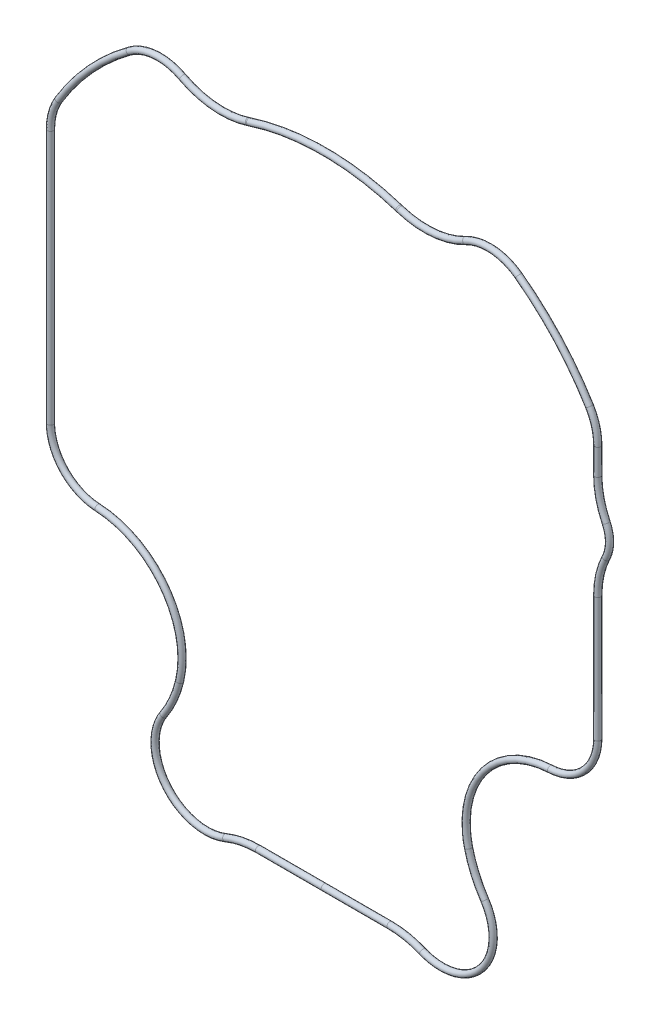
ISO-10303-21;
HEADER;
FILE_DESCRIPTION(('STEP AP214'),'2;1');
FILE_NAME('part.step','',(''),(''),'','','');
FILE_SCHEMA(('AUTOMOTIVE_DESIGN { 1 0 10303 214 1 1 1 1 }'));
ENDSEC;
DATA;
#1=APPLICATION_CONTEXT('core data for automotive mechanical design processes');
#2=APPLICATION_PROTOCOL_DEFINITION('international standard','automotive_design',2000,#1);
#3=PRODUCT_CONTEXT('',#1,'mechanical');
#4=PRODUCT('Part','Part','',(#3));
#5=PRODUCT_RELATED_PRODUCT_CATEGORY('part','',(#4));
#6=PRODUCT_DEFINITION_FORMATION('','',#4);
#7=PRODUCT_DEFINITION_CONTEXT('part definition',#1,'design');
#8=PRODUCT_DEFINITION('design','',#6,#7);
#9=PRODUCT_DEFINITION_SHAPE('','',#8);
#10=(LENGTH_UNIT() NAMED_UNIT(*) SI_UNIT(.MILLI.,.METRE.));
#11=(NAMED_UNIT(*) PLANE_ANGLE_UNIT() SI_UNIT($,.RADIAN.));
#12=(NAMED_UNIT(*) SI_UNIT($,.STERADIAN.) SOLID_ANGLE_UNIT());
#13=UNCERTAINTY_MEASURE_WITH_UNIT(LENGTH_MEASURE(1.E-05),#10,'distance_accuracy_value','');
#14=(GEOMETRIC_REPRESENTATION_CONTEXT(3) GLOBAL_UNCERTAINTY_ASSIGNED_CONTEXT((#13)) GLOBAL_UNIT_ASSIGNED_CONTEXT((#10,
#11,#12)) REPRESENTATION_CONTEXT('',''));
#15=CARTESIAN_POINT('',(0.,0.,0.));
#16=DIRECTION('',(0.,0.,1.));
#17=DIRECTION('',(1.,0.,0.));
#18=AXIS2_PLACEMENT_3D('',#15,#16,#17);
#19=CARTESIAN_POINT('',(0.,-133.9,0.));
#20=DIRECTION('',(-1.,0.,0.));
#21=DIRECTION('',(0.,0.,1.));
#22=AXIS2_PLACEMENT_3D('',#19,#20,#21);
#23=CYLINDRICAL_SURFACE('',#22,1.);
#24=CARTESIAN_POINT('',(-22.3011299795722,-133.9,0.));
#25=DIRECTION('',(1.,0.,0.));
#26=DIRECTION('',(0.,0.,-1.));
#27=AXIS2_PLACEMENT_3D('',#24,#25,#26);
#28=CIRCLE('',#27,1.);
#29=CARTESIAN_POINT('',(-22.3011299795722,-132.9,0.));
#30=VERTEX_POINT('',#29);
#31=EDGE_CURVE('E128',#30,#30,#28,.T.);
#32=ORIENTED_EDGE('',*,*,#31,.T.);
#33=EDGE_LOOP('',(#32));
#34=FACE_BOUND('',#33,.T.);
#35=CARTESIAN_POINT('',(0.,-133.9,0.));
#36=DIRECTION('',(1.,0.,0.));
#37=DIRECTION('',(0.,0.,-1.));
#38=AXIS2_PLACEMENT_3D('',#35,#36,#37);
#39=CIRCLE('',#38,1.);
#40=CARTESIAN_POINT('',(0.,-133.9,-1.));
#41=VERTEX_POINT('',#40);
#42=EDGE_CURVE('E131',#41,#41,#39,.T.);
#43=ORIENTED_EDGE('',*,*,#42,.F.);
#44=EDGE_LOOP('',(#43));
#45=FACE_BOUND('',#44,.T.);
#46=ADVANCED_FACE('F39',(#34,#45),#23,.T.);
#47=CARTESIAN_POINT('',(-22.3011299795722,-163.,0.));
#48=DIRECTION('',(0.,0.,1.));
#49=DIRECTION('',(1.,0.,0.));
#50=AXIS2_PLACEMENT_3D('',#47,#48,#49);
#51=TOROIDAL_SURFACE('',#50,29.1,1.);
#52=CARTESIAN_POINT('',(-33.3771970246141,-136.090322580645,0.));
#53=DIRECTION('',(0.924731182795699,0.380620860654362,0.));
#54=DIRECTION('',(0.,0.,-1.));
#55=AXIS2_PLACEMENT_3D('',#52,#53,#54);
#56=CIRCLE('',#55,1.);
#57=CARTESIAN_POINT('',(-33.7578178852685,-135.165591397849,0.));
#58=VERTEX_POINT('',#57);
#59=EDGE_CURVE('E125',#58,#58,#56,.T.);
#60=CARTESIAN_POINT('',(-22.3011299795722,-163.,0.));
#61=DIRECTION('',(0.,0.,1.));
#62=DIRECTION('',(1.,0.,0.));
#63=AXIS2_PLACEMENT_3D('',#60,#61,#62);
#64=CIRCLE('',#63,30.1);
#65=EDGE_CURVE('',#30,#58,#64,.T.);
#66=ORIENTED_EDGE('',*,*,#31,.F.);
#67=ORIENTED_EDGE('',*,*,#59,.T.);
#68=ORIENTED_EDGE('',*,*,#65,.T.);
#69=ORIENTED_EDGE('',*,*,#65,.F.);
#70=EDGE_LOOP('',(#66,#68,#67,#69));
#71=FACE_BOUND('',#70,.T.);
#72=ADVANCED_FACE('F138',(#71),#51,.T.);
#73=CARTESIAN_POINT('',(-40.,-120.,0.));
#74=DIRECTION('',(0.,0.,-1.));
#75=DIRECTION('',(-1.,0.,0.));
#76=AXIS2_PLACEMENT_3D('',#73,#74,#75);
#77=TOROIDAL_SURFACE('',#76,17.4,1.);
#78=CARTESIAN_POINT('',(-54.497710894711,-110.378338043073,0.));
#79=DIRECTION('',(-0.552969077984316,-0.833201775558103,0.));
#80=DIRECTION('',(0.,0.,-1.));
#81=AXIS2_PLACEMENT_3D('',#78,#79,#80);
#82=CIRCLE('',#81,1.);
#83=CARTESIAN_POINT('',(-53.6645091191529,-110.931307121057,0.));
#84=VERTEX_POINT('',#83);
#85=EDGE_CURVE('E122',#84,#84,#82,.T.);
#86=ORIENTED_EDGE('',*,*,#85,.T.);
#87=EDGE_LOOP('',(#86));
#88=FACE_BOUND('',#87,.T.);
#89=ORIENTED_EDGE('',*,*,#59,.F.);
#90=EDGE_LOOP('',(#89));
#91=FACE_BOUND('',#90,.T.);
#92=ADVANCED_FACE('F144',(#88,#91),#77,.T.);
#93=CARTESIAN_POINT('',(-87.0759003190326,-88.7572470938858,0.));
#94=DIRECTION('',(0.,0.,1.));
#95=DIRECTION('',(1.,0.,0.));
#96=AXIS2_PLACEMENT_3D('',#93,#94,#95);
#97=TOROIDAL_SURFACE('',#96,39.1,1.);
#98=CARTESIAN_POINT('',(-49.0182868864285,-97.7254163504547,0.));
#99=DIRECTION('',(-0.229364942623245,-0.973340496997549,0.));
#100=DIRECTION('',(0.,0.,-1.));
#101=AXIS2_PLACEMENT_3D('',#98,#99,#100);
#102=CIRCLE('',#101,1.);
#103=CARTESIAN_POINT('',(-48.0449463894309,-97.954781293078,0.));
#104=VERTEX_POINT('',#103);
#105=EDGE_CURVE('E119',#104,#104,#102,.T.);
#106=CARTESIAN_POINT('',(-87.0759003190326,-88.7572470938858,0.));
#107=DIRECTION('',(0.,0.,1.));
#108=DIRECTION('',(1.,0.,0.));
#109=AXIS2_PLACEMENT_3D('',#106,#107,#108);
#110=CIRCLE('',#109,40.1);
#111=EDGE_CURVE('',#84,#104,#110,.T.);
#112=ORIENTED_EDGE('',*,*,#85,.F.);
#113=ORIENTED_EDGE('',*,*,#105,.T.);
#114=ORIENTED_EDGE('',*,*,#111,.T.);
#115=ORIENTED_EDGE('',*,*,#111,.F.);
#116=EDGE_LOOP('',(#112,#114,#113,#115));
#117=FACE_BOUND('',#116,.T.);
#118=ADVANCED_FACE('F150',(#117),#97,.T.);
#119=CARTESIAN_POINT('',(-78.3158358460547,-90.821531577495,0.));
#120=DIRECTION('',(0.,0.,1.));
#121=DIRECTION('',(1.,0.,0.));
#122=AXIS2_PLACEMENT_3D('',#119,#120,#121);
#123=TOROIDAL_SURFACE('',#122,30.1,1.);
#124=CARTESIAN_POINT('',(-76.8327154425175,-60.7580927544227,0.));
#125=DIRECTION('',(0.998785342959213,-0.0492731031075466,0.));
#126=DIRECTION('',(0.,0.,-1.));
#127=AXIS2_PLACEMENT_3D('',#124,#125,#126);
#128=CIRCLE('',#127,1.);
#129=CARTESIAN_POINT('',(-76.78344233941,-59.7593074114635,0.));
#130=VERTEX_POINT('',#129);
#131=EDGE_CURVE('E116',#130,#130,#128,.T.);
#132=CARTESIAN_POINT('',(-78.3158358460547,-90.821531577495,0.));
#133=DIRECTION('',(0.,0.,1.));
#134=DIRECTION('',(1.,0.,0.));
#135=AXIS2_PLACEMENT_3D('',#132,#133,#134);
#136=CIRCLE('',#135,31.1);
#137=EDGE_CURVE('',#104,#130,#136,.T.);
#138=ORIENTED_EDGE('',*,*,#105,.F.);
#139=ORIENTED_EDGE('',*,*,#131,.T.);
#140=ORIENTED_EDGE('',*,*,#137,.T.);
#141=ORIENTED_EDGE('',*,*,#137,.F.);
#142=EDGE_LOOP('',(#138,#140,#139,#141));
#143=FACE_BOUND('',#142,.T.);
#144=ADVANCED_FACE('F154',(#143),#123,.T.);
#145=CARTESIAN_POINT('',(-76.,-43.878620458412,0.));
#146=DIRECTION('',(0.,0.,-1.));
#147=DIRECTION('',(-1.,0.,0.));
#148=AXIS2_PLACEMENT_3D('',#145,#146,#147);
#149=TOROIDAL_SURFACE('',#148,16.9,1.);
#150=CARTESIAN_POINT('',(-92.9,-43.878620458412,0.));
#151=DIRECTION('',(0.,-1.,0.));
#152=DIRECTION('',(0.,0.,-1.));
#153=AXIS2_PLACEMENT_3D('',#150,#151,#152);
#154=CIRCLE('',#153,1.);
#155=CARTESIAN_POINT('',(-92.9,-43.878620458412,-1.));
#156=VERTEX_POINT('',#155);
#157=EDGE_CURVE('E113',#156,#156,#154,.T.);
#158=ORIENTED_EDGE('',*,*,#157,.T.);
#159=EDGE_LOOP('',(#158));
#160=FACE_BOUND('',#159,.T.);
#161=ORIENTED_EDGE('',*,*,#131,.F.);
#162=EDGE_LOOP('',(#161));
#163=FACE_BOUND('',#162,.T.);
#164=ADVANCED_FACE('F158',(#160,#163),#149,.T.);
#165=CARTESIAN_POINT('',(-92.9,-43.878620458412,0.));
#166=DIRECTION('',(0.,1.,0.));
#167=DIRECTION('',(0.,0.,1.));
#168=AXIS2_PLACEMENT_3D('',#165,#166,#167);
#169=CYLINDRICAL_SURFACE('',#168,1.);
#170=CARTESIAN_POINT('',(-92.9,42.5,0.));
#171=DIRECTION('',(0.,-1.,0.));
#172=DIRECTION('',(0.,0.,-1.));
#173=AXIS2_PLACEMENT_3D('',#170,#171,#172);
#174=CIRCLE('',#173,1.);
#175=CARTESIAN_POINT('',(-93.9,42.5,0.));
#176=VERTEX_POINT('',#175);
#177=EDGE_CURVE('E110',#176,#176,#174,.T.);
#178=ORIENTED_EDGE('',*,*,#177,.T.);
#179=EDGE_LOOP('',(#178));
#180=FACE_BOUND('',#179,.T.);
#181=ORIENTED_EDGE('',*,*,#157,.F.);
#182=EDGE_LOOP('',(#181));
#183=FACE_BOUND('',#182,.T.);
#184=ADVANCED_FACE('F162',(#180,#183),#169,.T.);
#185=CARTESIAN_POINT('',(-73.5,42.5,0.));
#186=DIRECTION('',(0.,0.,-1.));
#187=DIRECTION('',(-1.,0.,0.));
#188=AXIS2_PLACEMENT_3D('',#185,#186,#187);
#189=TOROIDAL_SURFACE('',#188,19.4,1.);
#190=CARTESIAN_POINT('',(-90.0667511340075,52.5946895377649,0.));
#191=DIRECTION('',(-0.520344821534275,-0.853956244021006,0.));
#192=DIRECTION('',(0.,0.,-1.));
#193=AXIS2_PLACEMENT_3D('',#190,#191,#192);
#194=CIRCLE('',#193,1.);
#195=CARTESIAN_POINT('',(-90.9207073780285,53.1150343592992,0.));
#196=VERTEX_POINT('',#195);
#197=EDGE_CURVE('E107',#196,#196,#194,.T.);
#198=CARTESIAN_POINT('',(-73.5,42.5,0.));
#199=DIRECTION('',(0.,0.,-1.));
#200=DIRECTION('',(-1.,0.,0.));
#201=AXIS2_PLACEMENT_3D('',#198,#199,#200);
#202=CIRCLE('',#201,20.4);
#203=EDGE_CURVE('',#176,#196,#202,.T.);
#204=ORIENTED_EDGE('',*,*,#177,.F.);
#205=ORIENTED_EDGE('',*,*,#197,.T.);
#206=ORIENTED_EDGE('',*,*,#203,.T.);
#207=ORIENTED_EDGE('',*,*,#203,.F.);
#208=EDGE_LOOP('',(#204,#206,#205,#207));
#209=FACE_BOUND('',#208,.T.);
#210=ADVANCED_FACE('F166',(#209),#189,.T.);
#211=CARTESIAN_POINT('',(-11.0621306741118,4.45446523304476,0.));
#212=DIRECTION('',(0.,0.,-1.));
#213=DIRECTION('',(-1.,0.,0.));
#214=AXIS2_PLACEMENT_3D('',#211,#212,#213);
#215=TOROIDAL_SURFACE('',#214,92.5160053726973,1.);
#216=CARTESIAN_POINT('',(-66.0435084855954,78.860508966547,0.));
#217=DIRECTION('',(-0.804250501670065,-0.594290442934638,0.));
#218=DIRECTION('',(0.,0.,-1.));
#219=AXIS2_PLACEMENT_3D('',#216,#217,#218);
#220=CIRCLE('',#219,1.);
#221=CARTESIAN_POINT('',(-66.6377989285301,79.6647594682171,0.));
#222=VERTEX_POINT('',#221);
#223=EDGE_CURVE('E104',#222,#222,#220,.T.);
#224=CARTESIAN_POINT('',(-11.0621306741118,4.45446523304476,0.));
#225=DIRECTION('',(0.,0.,-1.));
#226=DIRECTION('',(-1.,0.,0.));
#227=AXIS2_PLACEMENT_3D('',#224,#225,#226);
#228=CIRCLE('',#227,93.5160053726973);
#229=EDGE_CURVE('',#196,#222,#228,.T.);
#230=ORIENTED_EDGE('',*,*,#197,.F.);
#231=ORIENTED_EDGE('',*,*,#223,.T.);
#232=ORIENTED_EDGE('',*,*,#229,.T.);
#233=ORIENTED_EDGE('',*,*,#229,.F.);
#234=EDGE_LOOP('',(#230,#232,#231,#233));
#235=FACE_BOUND('',#234,.T.);
#236=ADVANCED_FACE('F170',(#235),#215,.T.);
#237=CARTESIAN_POINT('',(-56.,65.2686754883229,0.));
#238=DIRECTION('',(0.,0.,-1.));
#239=DIRECTION('',(-1.,0.,0.));
#240=AXIS2_PLACEMENT_3D('',#237,#238,#239);
#241=TOROIDAL_SURFACE('',#240,16.9,1.);
#242=CARTESIAN_POINT('',(-48.1416378933798,80.2304984053754,0.));
#243=DIRECTION('',(-0.885314965506062,0.464991840628414,0.));
#244=DIRECTION('',(0.,0.,-1.));
#245=AXIS2_PLACEMENT_3D('',#242,#243,#244);
#246=CIRCLE('',#245,1.);
#247=CARTESIAN_POINT('',(-47.6766460527514,81.1158133708814,0.));
#248=VERTEX_POINT('',#247);
#249=EDGE_CURVE('E101',#248,#248,#246,.T.);
#250=CARTESIAN_POINT('',(-56.,65.2686754883229,0.));
#251=DIRECTION('',(0.,0.,-1.));
#252=DIRECTION('',(-1.,0.,0.));
#253=AXIS2_PLACEMENT_3D('',#250,#251,#252);
#254=CIRCLE('',#253,17.9);
#255=EDGE_CURVE('',#222,#248,#254,.T.);
#256=ORIENTED_EDGE('',*,*,#223,.F.);
#257=ORIENTED_EDGE('',*,*,#249,.T.);
#258=ORIENTED_EDGE('',*,*,#255,.T.);
#259=ORIENTED_EDGE('',*,*,#255,.F.);
#260=EDGE_LOOP('',(#256,#258,#257,#259));
#261=FACE_BOUND('',#260,.T.);
#262=ADVANCED_FACE('F174',(#261),#241,.T.);
#263=CARTESIAN_POINT('',(-34.6103753310929,105.993163901602,0.));
#264=DIRECTION('',(0.,0.,1.));
#265=DIRECTION('',(1.,0.,0.));
#266=AXIS2_PLACEMENT_3D('',#263,#264,#265);
#267=TOROIDAL_SURFACE('',#266,29.1,1.);
#268=CARTESIAN_POINT('',(-25.6825903621794,78.2965096713731,0.));
#269=DIRECTION('',(-0.951775059458029,-0.306796734326925,0.));
#270=DIRECTION('',(0.,0.,-1.));
#271=AXIS2_PLACEMENT_3D('',#268,#269,#270);
#272=CIRCLE('',#271,1.);
#273=CARTESIAN_POINT('',(-25.6825903621794,78.2965096713731,-1.));
#274=VERTEX_POINT('',#273);
#275=EDGE_CURVE('E98',#274,#274,#272,.T.);
#276=ORIENTED_EDGE('',*,*,#275,.T.);
#277=EDGE_LOOP('',(#276));
#278=FACE_BOUND('',#277,.T.);
#279=ORIENTED_EDGE('',*,*,#249,.F.);
#280=EDGE_LOOP('',(#279));
#281=FACE_BOUND('',#280,.T.);
#282=ADVANCED_FACE('F178',(#278,#281),#267,.T.);
#283=CARTESIAN_POINT('',(-25.6825903621794,78.2965096713731,0.));
#284=DIRECTION('',(0.951775059458041,0.306796734326887,0.));
#285=DIRECTION('',(-0.306796734326887,0.951775059458041,0.));
#286=AXIS2_PLACEMENT_3D('',#283,#284,#285);
#287=CYLINDRICAL_SURFACE('',#286,1.);
#288=CARTESIAN_POINT('',(-25.2800509085364,78.4262648993423,0.));
#289=DIRECTION('',(-0.951775059458041,-0.306796734326887,0.));
#290=DIRECTION('',(0.,0.,-1.));
#291=AXIS2_PLACEMENT_3D('',#288,#289,#290);
#292=CIRCLE('',#291,1.);
#293=CARTESIAN_POINT('',(-25.5868476428633,79.3780399588004,0.));
#294=VERTEX_POINT('',#293);
#295=EDGE_CURVE('E95',#294,#294,#292,.T.);
#296=ORIENTED_EDGE('',*,*,#295,.T.);
#297=EDGE_LOOP('',(#296));
#298=FACE_BOUND('',#297,.T.);
#299=ORIENTED_EDGE('',*,*,#275,.F.);
#300=EDGE_LOOP('',(#299));
#301=FACE_BOUND('',#300,.T.);
#302=ADVANCED_FACE('F182',(#298,#301),#287,.T.);
#303=CARTESIAN_POINT('',(0.,0.,0.));
#304=DIRECTION('',(0.,0.,-1.));
#305=DIRECTION('',(-1.,0.,0.));
#306=AXIS2_PLACEMENT_3D('',#303,#304,#305);
#307=TOROIDAL_SURFACE('',#306,82.4,1.);
#308=CARTESIAN_POINT('',(25.2800509085517,78.4262648993374,0.));
#309=DIRECTION('',(-0.951775059457978,0.306796734327083,0.));
#310=DIRECTION('',(0.,0.,-1.));
#311=AXIS2_PLACEMENT_3D('',#308,#309,#310);
#312=CIRCLE('',#311,1.);
#313=CARTESIAN_POINT('',(25.5868476428788,79.3780399587954,0.));
#314=VERTEX_POINT('',#313);
#315=EDGE_CURVE('E92',#314,#314,#312,.T.);
#316=CARTESIAN_POINT('',(0.,0.,0.));
#317=DIRECTION('',(0.,0.,-1.));
#318=DIRECTION('',(-1.,0.,0.));
#319=AXIS2_PLACEMENT_3D('',#316,#317,#318);
#320=CIRCLE('',#319,83.4);
#321=EDGE_CURVE('',#294,#314,#320,.T.);
#322=ORIENTED_EDGE('',*,*,#295,.F.);
#323=ORIENTED_EDGE('',*,*,#315,.T.);
#324=ORIENTED_EDGE('',*,*,#321,.T.);
#325=ORIENTED_EDGE('',*,*,#321,.F.);
#326=EDGE_LOOP('',(#322,#324,#323,#325));
#327=FACE_BOUND('',#326,.T.);
#328=ADVANCED_FACE('F186',(#327),#307,.T.);
#329=CARTESIAN_POINT('',(25.2800509085517,78.4262648993374,0.));
#330=DIRECTION('',(0.951775059457979,-0.306796734327079,0.));
#331=DIRECTION('',(0.306796734327079,0.951775059457979,0.));
#332=AXIS2_PLACEMENT_3D('',#329,#330,#331);
#333=CYLINDRICAL_SURFACE('',#332,1.);
#334=CARTESIAN_POINT('',(25.682590362175,78.2965096713745,0.));
#335=DIRECTION('',(-0.951775059457979,0.306796734327079,0.));
#336=DIRECTION('',(0.,0.,-1.));
#337=AXIS2_PLACEMENT_3D('',#334,#335,#336);
#338=CIRCLE('',#337,1.);
#339=CARTESIAN_POINT('',(25.3757936278479,77.3447346119165,0.));
#340=VERTEX_POINT('',#339);
#341=EDGE_CURVE('E89',#340,#340,#338,.T.);
#342=ORIENTED_EDGE('',*,*,#341,.T.);
#343=EDGE_LOOP('',(#342));
#344=FACE_BOUND('',#343,.T.);
#345=ORIENTED_EDGE('',*,*,#315,.F.);
#346=EDGE_LOOP('',(#345));
#347=FACE_BOUND('',#346,.T.);
#348=ADVANCED_FACE('F190',(#344,#347),#333,.T.);
#349=CARTESIAN_POINT('',(34.6103753310929,105.993163901602,0.));
#350=DIRECTION('',(0.,0.,1.));
#351=DIRECTION('',(1.,0.,0.));
#352=AXIS2_PLACEMENT_3D('',#349,#350,#351);
#353=TOROIDAL_SURFACE('',#352,29.1,1.);
#354=CARTESIAN_POINT('',(48.1416378933798,80.2304984053753,0.));
#355=DIRECTION('',(-0.885314965506061,-0.464991840628416,0.));
#356=DIRECTION('',(0.,0.,-1.));
#357=AXIS2_PLACEMENT_3D('',#354,#355,#356);
#358=CIRCLE('',#357,1.);
#359=CARTESIAN_POINT('',(48.6066297340082,79.3451834398692,0.));
#360=VERTEX_POINT('',#359);
#361=EDGE_CURVE('E86',#360,#360,#358,.T.);
#362=CARTESIAN_POINT('',(34.6103753310929,105.993163901602,0.));
#363=DIRECTION('',(0.,0.,1.));
#364=DIRECTION('',(1.,0.,0.));
#365=AXIS2_PLACEMENT_3D('',#362,#363,#364);
#366=CIRCLE('',#365,30.1);
#367=EDGE_CURVE('',#340,#360,#366,.T.);
#368=ORIENTED_EDGE('',*,*,#341,.F.);
#369=ORIENTED_EDGE('',*,*,#361,.T.);
#370=ORIENTED_EDGE('',*,*,#367,.T.);
#371=ORIENTED_EDGE('',*,*,#367,.F.);
#372=EDGE_LOOP('',(#368,#370,#369,#371));
#373=FACE_BOUND('',#372,.T.);
#374=ADVANCED_FACE('F194',(#373),#353,.T.);
#375=CARTESIAN_POINT('',(56.,65.2686754883229,0.));
#376=DIRECTION('',(0.,0.,-1.));
#377=DIRECTION('',(-1.,0.,0.));
#378=AXIS2_PLACEMENT_3D('',#375,#376,#377);
#379=TOROIDAL_SURFACE('',#378,16.9,1.);
#380=CARTESIAN_POINT('',(66.0435084855954,78.860508966547,0.));
#381=DIRECTION('',(-0.804250501670067,0.594290442934637,0.));
#382=DIRECTION('',(0.,0.,-1.));
#383=AXIS2_PLACEMENT_3D('',#380,#381,#382);
#384=CIRCLE('',#383,1.);
#385=CARTESIAN_POINT('',(66.63779892853,79.6647594682171,0.));
#386=VERTEX_POINT('',#385);
#387=EDGE_CURVE('E83',#386,#386,#384,.T.);
#388=ORIENTED_EDGE('',*,*,#387,.T.);
#389=EDGE_LOOP('',(#388));
#390=FACE_BOUND('',#389,.T.);
#391=ORIENTED_EDGE('',*,*,#361,.F.);
#392=EDGE_LOOP('',(#391));
#393=FACE_BOUND('',#392,.T.);
#394=ADVANCED_FACE('F198',(#390,#393),#379,.T.);
#395=CARTESIAN_POINT('',(11.0621306741118,4.45446523304477,0.));
#396=DIRECTION('',(0.,0.,-1.));
#397=DIRECTION('',(-1.,0.,0.));
#398=AXIS2_PLACEMENT_3D('',#395,#396,#397);
#399=TOROIDAL_SURFACE('',#398,92.5160053726973,1.);
#400=CARTESIAN_POINT('',(90.0667511340075,52.5946895377649,0.));
#401=DIRECTION('',(-0.520344821534275,0.853956244021006,0.));
#402=DIRECTION('',(0.,0.,-1.));
#403=AXIS2_PLACEMENT_3D('',#400,#401,#402);
#404=CIRCLE('',#403,1.);
#405=CARTESIAN_POINT('',(90.9207073780285,53.1150343592992,0.));
#406=VERTEX_POINT('',#405);
#407=EDGE_CURVE('E80',#406,#406,#404,.T.);
#408=CARTESIAN_POINT('',(11.0621306741118,4.45446523304477,0.));
#409=DIRECTION('',(0.,0.,-1.));
#410=DIRECTION('',(-1.,0.,0.));
#411=AXIS2_PLACEMENT_3D('',#408,#409,#410);
#412=CIRCLE('',#411,93.5160053726973);
#413=EDGE_CURVE('',#386,#406,#412,.T.);
#414=ORIENTED_EDGE('',*,*,#387,.F.);
#415=ORIENTED_EDGE('',*,*,#407,.T.);
#416=ORIENTED_EDGE('',*,*,#413,.T.);
#417=ORIENTED_EDGE('',*,*,#413,.F.);
#418=EDGE_LOOP('',(#414,#416,#415,#417));
#419=FACE_BOUND('',#418,.T.);
#420=ADVANCED_FACE('F202',(#419),#399,.T.);
#421=CARTESIAN_POINT('',(73.5,42.5,0.));
#422=DIRECTION('',(0.,0.,-1.));
#423=DIRECTION('',(-1.,0.,0.));
#424=AXIS2_PLACEMENT_3D('',#421,#422,#423);
#425=TOROIDAL_SURFACE('',#424,19.4,1.);
#426=CARTESIAN_POINT('',(92.9,42.5,0.));
#427=DIRECTION('',(0.,1.,0.));
#428=DIRECTION('',(0.,0.,-1.));
#429=AXIS2_PLACEMENT_3D('',#426,#427,#428);
#430=CIRCLE('',#429,1.);
#431=CARTESIAN_POINT('',(93.9,42.5,0.));
#432=VERTEX_POINT('',#431);
#433=EDGE_CURVE('E77',#432,#432,#430,.T.);
#434=CARTESIAN_POINT('',(73.5,42.5,0.));
#435=DIRECTION('',(0.,0.,-1.));
#436=DIRECTION('',(-1.,0.,0.));
#437=AXIS2_PLACEMENT_3D('',#434,#435,#436);
#438=CIRCLE('',#437,20.4);
#439=EDGE_CURVE('',#406,#432,#438,.T.);
#440=ORIENTED_EDGE('',*,*,#407,.F.);
#441=ORIENTED_EDGE('',*,*,#433,.T.);
#442=ORIENTED_EDGE('',*,*,#439,.T.);
#443=ORIENTED_EDGE('',*,*,#439,.F.);
#444=EDGE_LOOP('',(#440,#442,#441,#443));
#445=FACE_BOUND('',#444,.T.);
#446=ADVANCED_FACE('F206',(#445),#425,.T.);
#447=CARTESIAN_POINT('',(92.9,42.5,0.));
#448=DIRECTION('',(0.,-1.,0.));
#449=DIRECTION('',(0.,0.,-1.));
#450=AXIS2_PLACEMENT_3D('',#447,#448,#449);
#451=CYLINDRICAL_SURFACE('',#450,1.);
#452=CARTESIAN_POINT('',(92.9,33.6635217326557,0.));
#453=DIRECTION('',(0.,1.,0.));
#454=DIRECTION('',(0.,0.,-1.));
#455=AXIS2_PLACEMENT_3D('',#452,#453,#454);
#456=CIRCLE('',#455,1.);
#457=CARTESIAN_POINT('',(91.9,33.6635217326557,0.));
#458=VERTEX_POINT('',#457);
#459=EDGE_CURVE('E74',#458,#458,#456,.T.);
#460=ORIENTED_EDGE('',*,*,#459,.T.);
#461=EDGE_LOOP('',(#460));
#462=FACE_BOUND('',#461,.T.);
#463=ORIENTED_EDGE('',*,*,#433,.F.);
#464=EDGE_LOOP('',(#463));
#465=FACE_BOUND('',#464,.T.);
#466=ADVANCED_FACE('F210',(#462,#465),#451,.T.);
#467=CARTESIAN_POINT('',(122.,33.6635217326557,0.));
#468=DIRECTION('',(0.,0.,1.));
#469=DIRECTION('',(1.,0.,0.));
#470=AXIS2_PLACEMENT_3D('',#467,#468,#469);
#471=TOROIDAL_SURFACE('',#470,29.1,1.);
#472=CARTESIAN_POINT('',(95.7390243902439,21.1267294785025,0.));
#473=DIRECTION('',(-0.430817603235504,0.902439024390244,0.));
#474=DIRECTION('',(0.,0.,-1.));
#475=AXIS2_PLACEMENT_3D('',#472,#473,#474);
#476=CIRCLE('',#475,1.);
#477=CARTESIAN_POINT('',(94.8365853658537,20.695911875267,0.));
#478=VERTEX_POINT('',#477);
#479=EDGE_CURVE('E71',#478,#478,#476,.T.);
#480=CARTESIAN_POINT('',(122.,33.6635217326557,0.));
#481=DIRECTION('',(0.,0.,1.));
#482=DIRECTION('',(1.,0.,0.));
#483=AXIS2_PLACEMENT_3D('',#480,#481,#482);
#484=CIRCLE('',#483,30.1);
#485=EDGE_CURVE('',#458,#478,#484,.T.);
#486=ORIENTED_EDGE('',*,*,#459,.F.);
#487=ORIENTED_EDGE('',*,*,#479,.T.);
#488=ORIENTED_EDGE('',*,*,#485,.T.);
#489=ORIENTED_EDGE('',*,*,#485,.F.);
#490=EDGE_LOOP('',(#486,#488,#487,#489));
#491=FACE_BOUND('',#490,.T.);
#492=ADVANCED_FACE('F214',(#491),#471,.T.);
#493=CARTESIAN_POINT('',(85.,16.,0.));
#494=DIRECTION('',(0.,0.,-1.));
#495=DIRECTION('',(-1.,0.,0.));
#496=AXIS2_PLACEMENT_3D('',#493,#494,#495);
#497=TOROIDAL_SURFACE('',#496,11.9,1.);
#498=CARTESIAN_POINT('',(95.7390243902439,10.8732705214975,0.));
#499=DIRECTION('',(0.430817603235505,0.902439024390244,0.));
#500=DIRECTION('',(0.,0.,-1.));
#501=AXIS2_PLACEMENT_3D('',#498,#499,#500);
#502=CIRCLE('',#501,1.);
#503=CARTESIAN_POINT('',(94.8365853658537,11.304088124733,0.));
#504=VERTEX_POINT('',#503);
#505=EDGE_CURVE('E68',#504,#504,#502,.T.);
#506=ORIENTED_EDGE('',*,*,#505,.T.);
#507=EDGE_LOOP('',(#506));
#508=FACE_BOUND('',#507,.T.);
#509=ORIENTED_EDGE('',*,*,#479,.F.);
#510=EDGE_LOOP('',(#509));
#511=FACE_BOUND('',#510,.T.);
#512=ADVANCED_FACE('F218',(#508,#511),#497,.T.);
#513=CARTESIAN_POINT('',(122.,-1.6635217326557,0.));
#514=DIRECTION('',(0.,0.,1.));
#515=DIRECTION('',(1.,0.,0.));
#516=AXIS2_PLACEMENT_3D('',#513,#514,#515);
#517=TOROIDAL_SURFACE('',#516,29.1,1.);
#518=CARTESIAN_POINT('',(92.9,-1.6635217326557,0.));
#519=DIRECTION('',(0.,1.,0.));
#520=DIRECTION('',(0.,0.,-1.));
#521=AXIS2_PLACEMENT_3D('',#518,#519,#520);
#522=CIRCLE('',#521,1.);
#523=CARTESIAN_POINT('',(91.9,-1.6635217326557,0.));
#524=VERTEX_POINT('',#523);
#525=EDGE_CURVE('E65',#524,#524,#522,.T.);
#526=CARTESIAN_POINT('',(122.,-1.6635217326557,0.));
#527=DIRECTION('',(0.,0.,1.));
#528=DIRECTION('',(1.,0.,0.));
#529=AXIS2_PLACEMENT_3D('',#526,#527,#528);
#530=CIRCLE('',#529,30.1);
#531=EDGE_CURVE('',#504,#524,#530,.T.);
#532=ORIENTED_EDGE('',*,*,#505,.F.);
#533=ORIENTED_EDGE('',*,*,#525,.T.);
#534=ORIENTED_EDGE('',*,*,#531,.T.);
#535=ORIENTED_EDGE('',*,*,#531,.F.);
#536=EDGE_LOOP('',(#532,#534,#533,#535));
#537=FACE_BOUND('',#536,.T.);
#538=ADVANCED_FACE('F222',(#537),#517,.T.);
#539=CARTESIAN_POINT('',(92.9,-1.66352173265571,0.));
#540=DIRECTION('',(0.,-1.,0.));
#541=DIRECTION('',(0.,0.,-1.));
#542=AXIS2_PLACEMENT_3D('',#539,#540,#541);
#543=CYLINDRICAL_SURFACE('',#542,1.);
#544=CARTESIAN_POINT('',(92.9,-43.878620458412,0.));
#545=DIRECTION('',(0.,1.,0.));
#546=DIRECTION('',(0.,0.,-1.));
#547=AXIS2_PLACEMENT_3D('',#544,#545,#546);
#548=CIRCLE('',#547,1.);
#549=CARTESIAN_POINT('',(93.9,-43.878620458412,0.));
#550=VERTEX_POINT('',#549);
#551=EDGE_CURVE('E62',#550,#550,#548,.T.);
#552=ORIENTED_EDGE('',*,*,#551,.T.);
#553=EDGE_LOOP('',(#552));
#554=FACE_BOUND('',#553,.T.);
#555=ORIENTED_EDGE('',*,*,#525,.F.);
#556=EDGE_LOOP('',(#555));
#557=FACE_BOUND('',#556,.T.);
#558=ADVANCED_FACE('F226',(#554,#557),#543,.T.);
#559=CARTESIAN_POINT('',(76.,-43.878620458412,0.));
#560=DIRECTION('',(0.,0.,-1.));
#561=DIRECTION('',(-1.,0.,0.));
#562=AXIS2_PLACEMENT_3D('',#559,#560,#561);
#563=TOROIDAL_SURFACE('',#562,16.9,1.);
#564=CARTESIAN_POINT('',(76.8327154425175,-60.7580927544227,0.));
#565=DIRECTION('',(0.998785342959213,0.0492731031075465,0.));
#566=DIRECTION('',(0.,0.,-1.));
#567=AXIS2_PLACEMENT_3D('',#564,#565,#566);
#568=CIRCLE('',#567,1.);
#569=CARTESIAN_POINT('',(76.8819885456251,-61.7568780973819,0.));
#570=VERTEX_POINT('',#569);
#571=EDGE_CURVE('E59',#570,#570,#568,.T.);
#572=CARTESIAN_POINT('',(76.,-43.878620458412,0.));
#573=DIRECTION('',(0.,0.,-1.));
#574=DIRECTION('',(-1.,0.,0.));
#575=AXIS2_PLACEMENT_3D('',#572,#573,#574);
#576=CIRCLE('',#575,17.9);
#577=EDGE_CURVE('',#550,#570,#576,.T.);
#578=ORIENTED_EDGE('',*,*,#551,.F.);
#579=ORIENTED_EDGE('',*,*,#571,.T.);
#580=ORIENTED_EDGE('',*,*,#577,.T.);
#581=ORIENTED_EDGE('',*,*,#577,.F.);
#582=EDGE_LOOP('',(#578,#580,#579,#581));
#583=FACE_BOUND('',#582,.T.);
#584=ADVANCED_FACE('F230',(#583),#563,.T.);
#585=CARTESIAN_POINT('',(78.3158358460547,-90.821531577495,0.));
#586=DIRECTION('',(0.,0.,1.));
#587=DIRECTION('',(1.,0.,0.));
#588=AXIS2_PLACEMENT_3D('',#585,#586,#587);
#589=TOROIDAL_SURFACE('',#588,30.1,1.);
#590=CARTESIAN_POINT('',(49.0182868864284,-97.7254163504547,0.));
#591=DIRECTION('',(-0.229364942623245,0.973340496997549,0.));
#592=DIRECTION('',(0.,0.,-1.));
#593=AXIS2_PLACEMENT_3D('',#590,#591,#592);
#594=CIRCLE('',#593,1.);
#595=CARTESIAN_POINT('',(48.0449463894308,-97.954781293078,0.));
#596=VERTEX_POINT('',#595);
#597=EDGE_CURVE('E54',#596,#596,#594,.T.);
#598=ORIENTED_EDGE('',*,*,#597,.T.);
#599=EDGE_LOOP('',(#598));
#600=FACE_BOUND('',#599,.T.);
#601=ORIENTED_EDGE('',*,*,#571,.F.);
#602=EDGE_LOOP('',(#601));
#603=FACE_BOUND('',#602,.T.);
#604=ADVANCED_FACE('F234',(#600,#603),#589,.T.);
#605=CARTESIAN_POINT('',(87.0759003190326,-88.7572470938858,0.));
#606=DIRECTION('',(0.,0.,1.));
#607=DIRECTION('',(1.,0.,0.));
#608=AXIS2_PLACEMENT_3D('',#605,#606,#607);
#609=TOROIDAL_SURFACE('',#608,39.1000000000001,1.);
#610=CARTESIAN_POINT('',(54.4977108947109,-110.378338043073,0.));
#611=DIRECTION('',(-0.552969077984322,0.833201775558099,0.));
#612=DIRECTION('',(0.,0.,-1.));
#613=AXIS2_PLACEMENT_3D('',#610,#611,#612);
#614=CIRCLE('',#613,1.);
#615=CARTESIAN_POINT('',(53.6645091191528,-110.931307121057,0.));
#616=VERTEX_POINT('',#615);
#617=EDGE_CURVE('E50',#616,#616,#614,.T.);
#618=CARTESIAN_POINT('',(87.0759003190326,-88.7572470938858,0.));
#619=DIRECTION('',(0.,0.,1.));
#620=DIRECTION('',(1.,0.,0.));
#621=AXIS2_PLACEMENT_3D('',#618,#619,#620);
#622=CIRCLE('',#621,40.1000000000001);
#623=EDGE_CURVE('',#596,#616,#622,.T.);
#624=ORIENTED_EDGE('',*,*,#597,.F.);
#625=ORIENTED_EDGE('',*,*,#617,.T.);
#626=ORIENTED_EDGE('',*,*,#623,.T.);
#627=ORIENTED_EDGE('',*,*,#623,.F.);
#628=EDGE_LOOP('',(#624,#626,#625,#627));
#629=FACE_BOUND('',#628,.T.);
#630=ADVANCED_FACE('F238',(#629),#609,.T.);
#631=CARTESIAN_POINT('',(40.,-120.,0.));
#632=DIRECTION('',(0.,0.,-1.));
#633=DIRECTION('',(-1.,0.,0.));
#634=AXIS2_PLACEMENT_3D('',#631,#632,#633);
#635=TOROIDAL_SURFACE('',#634,17.4,1.);
#636=CARTESIAN_POINT('',(33.3771970246141,-136.090322580645,0.));
#637=DIRECTION('',(0.9247311827957,-0.38062086065436,0.));
#638=DIRECTION('',(0.,0.,-1.));
#639=AXIS2_PLACEMENT_3D('',#636,#637,#638);
#640=CIRCLE('',#639,1.);
#641=CARTESIAN_POINT('',(33.7578178852685,-135.165591397849,0.));
#642=VERTEX_POINT('',#641);
#643=EDGE_CURVE('E46',#642,#642,#640,.T.);
#644=ORIENTED_EDGE('',*,*,#643,.T.);
#645=EDGE_LOOP('',(#644));
#646=FACE_BOUND('',#645,.T.);
#647=ORIENTED_EDGE('',*,*,#617,.F.);
#648=EDGE_LOOP('',(#647));
#649=FACE_BOUND('',#648,.T.);
#650=ADVANCED_FACE('F242',(#646,#649),#635,.T.);
#651=CARTESIAN_POINT('',(22.3011299795722,-163.,0.));
#652=DIRECTION('',(0.,0.,1.));
#653=DIRECTION('',(1.,0.,0.));
#654=AXIS2_PLACEMENT_3D('',#651,#652,#653);
#655=TOROIDAL_SURFACE('',#654,29.1,1.);
#656=CARTESIAN_POINT('',(22.3011299795722,-133.9,0.));
#657=DIRECTION('',(1.,0.,0.));
#658=DIRECTION('',(0.,0.,-1.));
#659=AXIS2_PLACEMENT_3D('',#656,#657,#658);
#660=CIRCLE('',#659,1.);
#661=CARTESIAN_POINT('',(22.3011299795722,-132.9,0.));
#662=VERTEX_POINT('',#661);
#663=EDGE_CURVE('E10',#662,#662,#660,.T.);
#664=CARTESIAN_POINT('',(22.3011299795722,-163.,0.));
#665=DIRECTION('',(0.,0.,1.));
#666=DIRECTION('',(1.,0.,0.));
#667=AXIS2_PLACEMENT_3D('',#664,#665,#666);
#668=CIRCLE('',#667,30.1);
#669=EDGE_CURVE('',#642,#662,#668,.T.);
#670=ORIENTED_EDGE('',*,*,#643,.F.);
#671=ORIENTED_EDGE('',*,*,#663,.T.);
#672=ORIENTED_EDGE('',*,*,#669,.T.);
#673=ORIENTED_EDGE('',*,*,#669,.F.);
#674=EDGE_LOOP('',(#670,#672,#671,#673));
#675=FACE_BOUND('',#674,.T.);
#676=ADVANCED_FACE('F245',(#675),#655,.T.);
#677=CARTESIAN_POINT('',(22.3011299795722,-133.9,0.));
#678=DIRECTION('',(-1.,0.,0.));
#679=DIRECTION('',(0.,0.,1.));
#680=AXIS2_PLACEMENT_3D('',#677,#678,#679);
#681=CYLINDRICAL_SURFACE('',#680,1.);
#682=ORIENTED_EDGE('',*,*,#42,.T.);
#683=EDGE_LOOP('',(#682));
#684=FACE_BOUND('',#683,.T.);
#685=ORIENTED_EDGE('',*,*,#663,.F.);
#686=EDGE_LOOP('',(#685));
#687=FACE_BOUND('',#686,.T.);
#688=ADVANCED_FACE('F41',(#684,#687),#681,.T.);
#689=CLOSED_SHELL('',(#46,#72,#92,#118,#144,#164,#184,#210,#236,#262,#282,#302,#328,#348,#374,
#394,#420,#446,#466,#492,#512,#538,#558,#584,#604,#630,#650,#676,#688));
#690=MANIFOLD_SOLID_BREP('B2',#689);
#691=ADVANCED_BREP_SHAPE_REPRESENTATION('',(#18,#690),#14);
#692=SHAPE_DEFINITION_REPRESENTATION(#9,#691);
ENDSEC;
END-ISO-10303-21;
